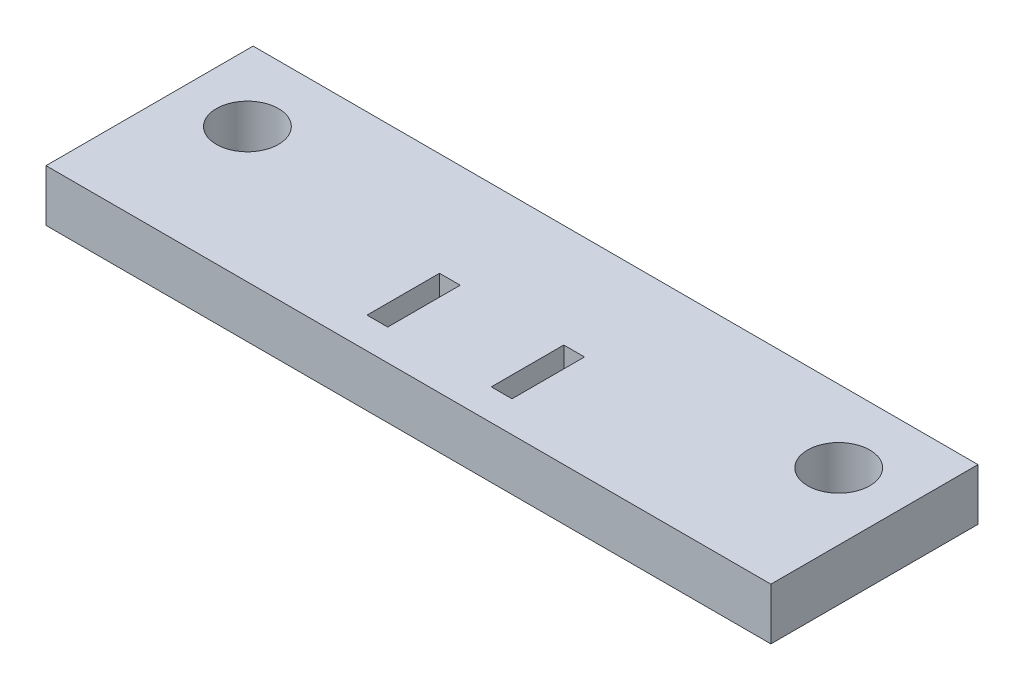
ISO-10303-21;
HEADER;
FILE_DESCRIPTION(('STEP AP214'),'2;1');
FILE_NAME('part.step','',(''),(''),'','','');
FILE_SCHEMA(('AUTOMOTIVE_DESIGN { 1 0 10303 214 1 1 1 1 }'));
ENDSEC;
DATA;
#1=APPLICATION_CONTEXT('core data for automotive mechanical design processes');
#2=APPLICATION_PROTOCOL_DEFINITION('international standard','automotive_design',2000,#1);
#3=PRODUCT_CONTEXT('',#1,'mechanical');
#4=PRODUCT('Part','Part','',(#3));
#5=PRODUCT_RELATED_PRODUCT_CATEGORY('part','',(#4));
#6=PRODUCT_DEFINITION_FORMATION('','',#4);
#7=PRODUCT_DEFINITION_CONTEXT('part definition',#1,'design');
#8=PRODUCT_DEFINITION('design','',#6,#7);
#9=PRODUCT_DEFINITION_SHAPE('','',#8);
#10=(LENGTH_UNIT() NAMED_UNIT(*) SI_UNIT(.MILLI.,.METRE.));
#11=(NAMED_UNIT(*) PLANE_ANGLE_UNIT() SI_UNIT($,.RADIAN.));
#12=(NAMED_UNIT(*) SI_UNIT($,.STERADIAN.) SOLID_ANGLE_UNIT());
#13=UNCERTAINTY_MEASURE_WITH_UNIT(LENGTH_MEASURE(1.E-05),#10,'distance_accuracy_value','');
#14=(GEOMETRIC_REPRESENTATION_CONTEXT(3) GLOBAL_UNCERTAINTY_ASSIGNED_CONTEXT((#13)) GLOBAL_UNIT_ASSIGNED_CONTEXT((#10,
#11,#12)) REPRESENTATION_CONTEXT('',''));
#15=CARTESIAN_POINT('',(0.,0.,0.));
#16=DIRECTION('',(0.,0.,1.));
#17=DIRECTION('',(1.,0.,0.));
#18=AXIS2_PLACEMENT_3D('',#15,#16,#17);
#19=CARTESIAN_POINT('',(0.,5.,0.));
#20=DIRECTION('',(0.,1.,0.));
#21=DIRECTION('',(0.,0.,1.));
#22=AXIS2_PLACEMENT_3D('',#19,#20,#21);
#23=PLANE('',#22);
#24=CARTESIAN_POINT('',(-28.55,5.,-3.));
#25=DIRECTION('',(0.,1.,0.));
#26=DIRECTION('',(0.,0.,1.));
#27=AXIS2_PLACEMENT_3D('',#24,#25,#26);
#28=CIRCLE('',#27,3.);
#29=CARTESIAN_POINT('',(-28.55,5.,0.));
#30=VERTEX_POINT('',#29);
#31=EDGE_CURVE('E199',#30,#30,#28,.T.);
#32=ORIENTED_EDGE('',*,*,#31,.F.);
#33=EDGE_LOOP('',(#32));
#34=FACE_BOUND('',#33,.T.);
#35=DIRECTION('',(0.,0.,-1.));
#36=VECTOR('',#35,1.);
#37=CARTESIAN_POINT('',(35.,5.,-10.));
#38=LINE('',#37,#36);
#39=CARTESIAN_POINT('',(35.,5.,10.));
#40=VERTEX_POINT('',#39);
#41=CARTESIAN_POINT('',(35.,5.,-10.));
#42=VERTEX_POINT('',#41);
#43=EDGE_CURVE('E205',#40,#42,#38,.T.);
#44=ORIENTED_EDGE('',*,*,#43,.T.);
#45=DIRECTION('',(-1.,0.,0.));
#46=VECTOR('',#45,1.);
#47=CARTESIAN_POINT('',(-35.,5.,-10.));
#48=LINE('',#47,#46);
#49=CARTESIAN_POINT('',(-35.,5.,-10.));
#50=VERTEX_POINT('',#49);
#51=EDGE_CURVE('E208',#42,#50,#48,.T.);
#52=ORIENTED_EDGE('',*,*,#51,.T.);
#53=DIRECTION('',(0.,0.,1.));
#54=VECTOR('',#53,1.);
#55=CARTESIAN_POINT('',(-35.,5.,-10.));
#56=LINE('',#55,#54);
#57=CARTESIAN_POINT('',(-35.,5.,10.));
#58=VERTEX_POINT('',#57);
#59=EDGE_CURVE('E211',#50,#58,#56,.T.);
#60=ORIENTED_EDGE('',*,*,#59,.T.);
#61=DIRECTION('',(1.,0.,0.));
#62=VECTOR('',#61,1.);
#63=CARTESIAN_POINT('',(-35.,5.,10.));
#64=LINE('',#63,#62);
#65=EDGE_CURVE('E213',#58,#40,#64,.T.);
#66=ORIENTED_EDGE('',*,*,#65,.T.);
#67=EDGE_LOOP('',(#44,#52,#60,#66));
#68=FACE_BOUND('',#67,.T.);
#69=CARTESIAN_POINT('',(28.55,5.,-3.));
#70=DIRECTION('',(0.,1.,0.));
#71=DIRECTION('',(0.,0.,1.));
#72=AXIS2_PLACEMENT_3D('',#69,#70,#71);
#73=CIRCLE('',#72,3.);
#74=CARTESIAN_POINT('',(28.55,5.,0.));
#75=VERTEX_POINT('',#74);
#76=EDGE_CURVE('E193',#75,#75,#73,.T.);
#77=ORIENTED_EDGE('',*,*,#76,.F.);
#78=EDGE_LOOP('',(#77));
#79=FACE_BOUND('',#78,.T.);
#80=DIRECTION('',(1.,0.,0.));
#81=VECTOR('',#80,1.);
#82=CARTESIAN_POINT('',(-7.,5.,7.));
#83=LINE('',#82,#81);
#84=CARTESIAN_POINT('',(-7.,5.,7.));
#85=VERTEX_POINT('',#84);
#86=CARTESIAN_POINT('',(-5.,5.,7.));
#87=VERTEX_POINT('',#86);
#88=EDGE_CURVE('E164',#85,#87,#83,.T.);
#89=ORIENTED_EDGE('',*,*,#88,.F.);
#90=DIRECTION('',(0.,0.,1.));
#91=VECTOR('',#90,1.);
#92=CARTESIAN_POINT('',(-7.,5.,7.));
#93=LINE('',#92,#91);
#94=CARTESIAN_POINT('',(-7.,5.,0.));
#95=VERTEX_POINT('',#94);
#96=EDGE_CURVE('E162',#95,#85,#93,.T.);
#97=ORIENTED_EDGE('',*,*,#96,.F.);
#98=DIRECTION('',(-1.,0.,0.));
#99=VECTOR('',#98,1.);
#100=CARTESIAN_POINT('',(-7.,5.,0.));
#101=LINE('',#100,#99);
#102=CARTESIAN_POINT('',(-5.,5.,0.));
#103=VERTEX_POINT('',#102);
#104=EDGE_CURVE('E170',#103,#95,#101,.T.);
#105=ORIENTED_EDGE('',*,*,#104,.F.);
#106=DIRECTION('',(0.,0.,-1.));
#107=VECTOR('',#106,1.);
#108=CARTESIAN_POINT('',(-5.,5.,7.));
#109=LINE('',#108,#107);
#110=EDGE_CURVE('E167',#87,#103,#109,.T.);
#111=ORIENTED_EDGE('',*,*,#110,.F.);
#112=EDGE_LOOP('',(#89,#97,#105,#111));
#113=FACE_BOUND('',#112,.T.);
#114=DIRECTION('',(1.,0.,0.));
#115=VECTOR('',#114,1.);
#116=CARTESIAN_POINT('',(5.,5.,7.));
#117=LINE('',#116,#115);
#118=CARTESIAN_POINT('',(5.,5.,7.));
#119=VERTEX_POINT('',#118);
#120=CARTESIAN_POINT('',(7.,5.,7.));
#121=VERTEX_POINT('',#120);
#122=EDGE_CURVE('E134',#119,#121,#117,.T.);
#123=ORIENTED_EDGE('',*,*,#122,.F.);
#124=DIRECTION('',(0.,0.,1.));
#125=VECTOR('',#124,1.);
#126=CARTESIAN_POINT('',(5.,5.,7.));
#127=LINE('',#126,#125);
#128=CARTESIAN_POINT('',(5.,5.,0.));
#129=VERTEX_POINT('',#128);
#130=EDGE_CURVE('E126',#129,#119,#127,.T.);
#131=ORIENTED_EDGE('',*,*,#130,.F.);
#132=DIRECTION('',(-1.,0.,0.));
#133=VECTOR('',#132,1.);
#134=CARTESIAN_POINT('',(5.,5.,0.));
#135=LINE('',#134,#133);
#136=CARTESIAN_POINT('',(7.,5.,0.));
#137=VERTEX_POINT('',#136);
#138=EDGE_CURVE('E148',#137,#129,#135,.T.);
#139=ORIENTED_EDGE('',*,*,#138,.F.);
#140=DIRECTION('',(0.,0.,-1.));
#141=VECTOR('',#140,1.);
#142=CARTESIAN_POINT('',(7.,5.,7.));
#143=LINE('',#142,#141);
#144=EDGE_CURVE('E146',#121,#137,#143,.T.);
#145=ORIENTED_EDGE('',*,*,#144,.F.);
#146=EDGE_LOOP('',(#123,#131,#139,#145));
#147=FACE_BOUND('',#146,.T.);
#148=ADVANCED_FACE('F37',(#34,#68,#79,#113,#147),#23,.T.);
#149=CARTESIAN_POINT('',(0.,0.,0.));
#150=DIRECTION('',(0.,1.,0.));
#151=DIRECTION('',(0.,0.,1.));
#152=AXIS2_PLACEMENT_3D('',#149,#150,#151);
#153=PLANE('',#152);
#154=DIRECTION('',(0.,0.,1.));
#155=VECTOR('',#154,1.);
#156=CARTESIAN_POINT('',(-7.,0.,7.));
#157=LINE('',#156,#155);
#158=CARTESIAN_POINT('',(-7.,0.,0.));
#159=VERTEX_POINT('',#158);
#160=CARTESIAN_POINT('',(-7.,0.,7.));
#161=VERTEX_POINT('',#160);
#162=EDGE_CURVE('E142',#159,#161,#157,.T.);
#163=ORIENTED_EDGE('',*,*,#162,.T.);
#164=DIRECTION('',(1.,0.,0.));
#165=VECTOR('',#164,1.);
#166=CARTESIAN_POINT('',(-7.,0.,7.));
#167=LINE('',#166,#165);
#168=CARTESIAN_POINT('',(-5.,0.,7.));
#169=VERTEX_POINT('',#168);
#170=EDGE_CURVE('E175',#161,#169,#167,.T.);
#171=ORIENTED_EDGE('',*,*,#170,.T.);
#172=DIRECTION('',(0.,0.,-1.));
#173=VECTOR('',#172,1.);
#174=CARTESIAN_POINT('',(-5.,0.,7.));
#175=LINE('',#174,#173);
#176=CARTESIAN_POINT('',(-5.,0.,0.));
#177=VERTEX_POINT('',#176);
#178=EDGE_CURVE('E178',#169,#177,#175,.T.);
#179=ORIENTED_EDGE('',*,*,#178,.T.);
#180=DIRECTION('',(-1.,0.,0.));
#181=VECTOR('',#180,1.);
#182=CARTESIAN_POINT('',(-7.,0.,0.));
#183=LINE('',#182,#181);
#184=EDGE_CURVE('E165',#177,#159,#183,.T.);
#185=ORIENTED_EDGE('',*,*,#184,.T.);
#186=EDGE_LOOP('',(#163,#171,#179,#185));
#187=FACE_BOUND('',#186,.T.);
#188=DIRECTION('',(0.,0.,-1.));
#189=VECTOR('',#188,1.);
#190=CARTESIAN_POINT('',(35.,0.,-10.));
#191=LINE('',#190,#189);
#192=CARTESIAN_POINT('',(35.,0.,10.));
#193=VERTEX_POINT('',#192);
#194=CARTESIAN_POINT('',(35.,0.,-10.));
#195=VERTEX_POINT('',#194);
#196=EDGE_CURVE('E202',#193,#195,#191,.T.);
#197=ORIENTED_EDGE('',*,*,#196,.F.);
#198=DIRECTION('',(1.,0.,0.));
#199=VECTOR('',#198,1.);
#200=CARTESIAN_POINT('',(-35.,0.,10.));
#201=LINE('',#200,#199);
#202=CARTESIAN_POINT('',(-35.,0.,10.));
#203=VERTEX_POINT('',#202);
#204=EDGE_CURVE('E209',#203,#193,#201,.T.);
#205=ORIENTED_EDGE('',*,*,#204,.F.);
#206=DIRECTION('',(0.,0.,1.));
#207=VECTOR('',#206,1.);
#208=CARTESIAN_POINT('',(-35.,0.,-10.));
#209=LINE('',#208,#207);
#210=CARTESIAN_POINT('',(-35.,0.,-10.));
#211=VERTEX_POINT('',#210);
#212=EDGE_CURVE('E220',#211,#203,#209,.T.);
#213=ORIENTED_EDGE('',*,*,#212,.F.);
#214=DIRECTION('',(-1.,0.,0.));
#215=VECTOR('',#214,1.);
#216=CARTESIAN_POINT('',(-35.,0.,-10.));
#217=LINE('',#216,#215);
#218=EDGE_CURVE('E218',#195,#211,#217,.T.);
#219=ORIENTED_EDGE('',*,*,#218,.F.);
#220=EDGE_LOOP('',(#197,#205,#213,#219));
#221=FACE_BOUND('',#220,.T.);
#222=CARTESIAN_POINT('',(-28.55,0.,-3.));
#223=DIRECTION('',(0.,1.,0.));
#224=DIRECTION('',(0.,0.,1.));
#225=AXIS2_PLACEMENT_3D('',#222,#223,#224);
#226=CIRCLE('',#225,3.);
#227=CARTESIAN_POINT('',(-28.55,0.,0.));
#228=VERTEX_POINT('',#227);
#229=EDGE_CURVE('E196',#228,#228,#226,.T.);
#230=ORIENTED_EDGE('',*,*,#229,.T.);
#231=EDGE_LOOP('',(#230));
#232=FACE_BOUND('',#231,.T.);
#233=CARTESIAN_POINT('',(28.55,0.,-3.));
#234=DIRECTION('',(0.,1.,0.));
#235=DIRECTION('',(0.,0.,1.));
#236=AXIS2_PLACEMENT_3D('',#233,#234,#235);
#237=CIRCLE('',#236,3.);
#238=CARTESIAN_POINT('',(28.55,0.,0.));
#239=VERTEX_POINT('',#238);
#240=EDGE_CURVE('E192',#239,#239,#237,.T.);
#241=ORIENTED_EDGE('',*,*,#240,.T.);
#242=EDGE_LOOP('',(#241));
#243=FACE_BOUND('',#242,.T.);
#244=DIRECTION('',(0.,0.,1.));
#245=VECTOR('',#244,1.);
#246=CARTESIAN_POINT('',(5.,0.,7.));
#247=LINE('',#246,#245);
#248=CARTESIAN_POINT('',(5.,0.,0.));
#249=VERTEX_POINT('',#248);
#250=CARTESIAN_POINT('',(5.,0.,7.));
#251=VERTEX_POINT('',#250);
#252=EDGE_CURVE('E60',#249,#251,#247,.T.);
#253=ORIENTED_EDGE('',*,*,#252,.T.);
#254=DIRECTION('',(1.,0.,0.));
#255=VECTOR('',#254,1.);
#256=CARTESIAN_POINT('',(5.,0.,7.));
#257=LINE('',#256,#255);
#258=CARTESIAN_POINT('',(7.,0.,7.));
#259=VERTEX_POINT('',#258);
#260=EDGE_CURVE('E141',#251,#259,#257,.T.);
#261=ORIENTED_EDGE('',*,*,#260,.T.);
#262=DIRECTION('',(0.,0.,-1.));
#263=VECTOR('',#262,1.);
#264=CARTESIAN_POINT('',(7.,0.,7.));
#265=LINE('',#264,#263);
#266=CARTESIAN_POINT('',(7.,0.,0.));
#267=VERTEX_POINT('',#266);
#268=EDGE_CURVE('E154',#259,#267,#265,.T.);
#269=ORIENTED_EDGE('',*,*,#268,.T.);
#270=DIRECTION('',(-1.,0.,0.));
#271=VECTOR('',#270,1.);
#272=CARTESIAN_POINT('',(5.,0.,0.));
#273=LINE('',#272,#271);
#274=EDGE_CURVE('E135',#267,#249,#273,.T.);
#275=ORIENTED_EDGE('',*,*,#274,.T.);
#276=EDGE_LOOP('',(#253,#261,#269,#275));
#277=FACE_BOUND('',#276,.T.);
#278=ADVANCED_FACE('F238',(#187,#221,#232,#243,#277),#153,.F.);
#279=CARTESIAN_POINT('',(35.,5.,-10.));
#280=DIRECTION('',(-1.,0.,0.));
#281=DIRECTION('',(0.,0.,1.));
#282=AXIS2_PLACEMENT_3D('',#279,#280,#281);
#283=PLANE('',#282);
#284=ORIENTED_EDGE('',*,*,#196,.T.);
#285=DIRECTION('',(0.,-1.,0.));
#286=VECTOR('',#285,1.);
#287=CARTESIAN_POINT('',(35.,5.,-10.));
#288=LINE('',#287,#286);
#289=EDGE_CURVE('E11',#42,#195,#288,.T.);
#290=ORIENTED_EDGE('',*,*,#289,.F.);
#291=ORIENTED_EDGE('',*,*,#43,.F.);
#292=DIRECTION('',(0.,-1.,0.));
#293=VECTOR('',#292,1.);
#294=CARTESIAN_POINT('',(35.,5.,10.));
#295=LINE('',#294,#293);
#296=EDGE_CURVE('E215',#40,#193,#295,.T.);
#297=ORIENTED_EDGE('',*,*,#296,.T.);
#298=EDGE_LOOP('',(#284,#290,#291,#297));
#299=FACE_BOUND('',#298,.T.);
#300=ADVANCED_FACE('F39',(#299),#283,.F.);
#301=CARTESIAN_POINT('',(-35.,5.,-10.));
#302=DIRECTION('',(0.,0.,1.));
#303=DIRECTION('',(1.,0.,0.));
#304=AXIS2_PLACEMENT_3D('',#301,#302,#303);
#305=PLANE('',#304);
#306=ORIENTED_EDGE('',*,*,#218,.T.);
#307=DIRECTION('',(0.,-1.,0.));
#308=VECTOR('',#307,1.);
#309=CARTESIAN_POINT('',(-35.,5.,-10.));
#310=LINE('',#309,#308);
#311=EDGE_CURVE('E45',#50,#211,#310,.T.);
#312=ORIENTED_EDGE('',*,*,#311,.F.);
#313=ORIENTED_EDGE('',*,*,#51,.F.);
#314=ORIENTED_EDGE('',*,*,#289,.T.);
#315=EDGE_LOOP('',(#306,#312,#313,#314));
#316=FACE_BOUND('',#315,.T.);
#317=ADVANCED_FACE('F249',(#316),#305,.F.);
#318=CARTESIAN_POINT('',(-35.,5.,-10.));
#319=DIRECTION('',(1.,0.,0.));
#320=DIRECTION('',(0.,0.,-1.));
#321=AXIS2_PLACEMENT_3D('',#318,#319,#320);
#322=PLANE('',#321);
#323=ORIENTED_EDGE('',*,*,#212,.T.);
#324=DIRECTION('',(0.,-1.,0.));
#325=VECTOR('',#324,1.);
#326=CARTESIAN_POINT('',(-35.,5.,10.));
#327=LINE('',#326,#325);
#328=EDGE_CURVE('E225',#58,#203,#327,.T.);
#329=ORIENTED_EDGE('',*,*,#328,.F.);
#330=ORIENTED_EDGE('',*,*,#59,.F.);
#331=ORIENTED_EDGE('',*,*,#311,.T.);
#332=EDGE_LOOP('',(#323,#329,#330,#331));
#333=FACE_BOUND('',#332,.T.);
#334=ADVANCED_FACE('F232',(#333),#322,.F.);
#335=CARTESIAN_POINT('',(-35.,5.,10.));
#336=DIRECTION('',(0.,0.,-1.));
#337=DIRECTION('',(-1.,0.,0.));
#338=AXIS2_PLACEMENT_3D('',#335,#336,#337);
#339=PLANE('',#338);
#340=ORIENTED_EDGE('',*,*,#204,.T.);
#341=ORIENTED_EDGE('',*,*,#296,.F.);
#342=ORIENTED_EDGE('',*,*,#65,.F.);
#343=ORIENTED_EDGE('',*,*,#328,.T.);
#344=EDGE_LOOP('',(#340,#341,#342,#343));
#345=FACE_BOUND('',#344,.T.);
#346=ADVANCED_FACE('F242',(#345),#339,.F.);
#347=CARTESIAN_POINT('',(-28.55,5.,-3.));
#348=DIRECTION('',(0.,-1.,0.));
#349=DIRECTION('',(0.,0.,-1.));
#350=AXIS2_PLACEMENT_3D('',#347,#348,#349);
#351=CYLINDRICAL_SURFACE('',#350,3.);
#352=ORIENTED_EDGE('',*,*,#31,.T.);
#353=EDGE_LOOP('',(#352));
#354=FACE_BOUND('',#353,.T.);
#355=ORIENTED_EDGE('',*,*,#229,.F.);
#356=EDGE_LOOP('',(#355));
#357=FACE_BOUND('',#356,.T.);
#358=ADVANCED_FACE('F266',(#354,#357),#351,.F.);
#359=CARTESIAN_POINT('',(28.55,5.,-3.));
#360=DIRECTION('',(0.,-1.,0.));
#361=DIRECTION('',(0.,0.,-1.));
#362=AXIS2_PLACEMENT_3D('',#359,#360,#361);
#363=CYLINDRICAL_SURFACE('',#362,3.);
#364=ORIENTED_EDGE('',*,*,#76,.T.);
#365=EDGE_LOOP('',(#364));
#366=FACE_BOUND('',#365,.T.);
#367=ORIENTED_EDGE('',*,*,#240,.F.);
#368=EDGE_LOOP('',(#367));
#369=FACE_BOUND('',#368,.T.);
#370=ADVANCED_FACE('F273',(#366,#369),#363,.F.);
#371=CARTESIAN_POINT('',(-7.,5.,7.));
#372=DIRECTION('',(1.,0.,0.));
#373=DIRECTION('',(0.,0.,-1.));
#374=AXIS2_PLACEMENT_3D('',#371,#372,#373);
#375=PLANE('',#374);
#376=ORIENTED_EDGE('',*,*,#162,.F.);
#377=DIRECTION('',(0.,-1.,0.));
#378=VECTOR('',#377,1.);
#379=CARTESIAN_POINT('',(-7.,5.,0.));
#380=LINE('',#379,#378);
#381=EDGE_CURVE('E172',#95,#159,#380,.T.);
#382=ORIENTED_EDGE('',*,*,#381,.F.);
#383=ORIENTED_EDGE('',*,*,#96,.T.);
#384=DIRECTION('',(0.,-1.,0.));
#385=VECTOR('',#384,1.);
#386=CARTESIAN_POINT('',(-7.,5.,7.));
#387=LINE('',#386,#385);
#388=EDGE_CURVE('E189',#85,#161,#387,.T.);
#389=ORIENTED_EDGE('',*,*,#388,.T.);
#390=EDGE_LOOP('',(#376,#382,#383,#389));
#391=FACE_BOUND('',#390,.T.);
#392=ADVANCED_FACE('F278',(#391),#375,.T.);
#393=CARTESIAN_POINT('',(-7.,5.,7.));
#394=DIRECTION('',(0.,0.,-1.));
#395=DIRECTION('',(-1.,0.,0.));
#396=AXIS2_PLACEMENT_3D('',#393,#394,#395);
#397=PLANE('',#396);
#398=ORIENTED_EDGE('',*,*,#170,.F.);
#399=ORIENTED_EDGE('',*,*,#388,.F.);
#400=ORIENTED_EDGE('',*,*,#88,.T.);
#401=DIRECTION('',(0.,-1.,0.));
#402=VECTOR('',#401,1.);
#403=CARTESIAN_POINT('',(-5.,5.,7.));
#404=LINE('',#403,#402);
#405=EDGE_CURVE('E187',#87,#169,#404,.T.);
#406=ORIENTED_EDGE('',*,*,#405,.T.);
#407=EDGE_LOOP('',(#398,#399,#400,#406));
#408=FACE_BOUND('',#407,.T.);
#409=ADVANCED_FACE('F307',(#408),#397,.T.);
#410=CARTESIAN_POINT('',(-5.,5.,7.));
#411=DIRECTION('',(-1.,0.,0.));
#412=DIRECTION('',(0.,0.,1.));
#413=AXIS2_PLACEMENT_3D('',#410,#411,#412);
#414=PLANE('',#413);
#415=ORIENTED_EDGE('',*,*,#178,.F.);
#416=ORIENTED_EDGE('',*,*,#405,.F.);
#417=ORIENTED_EDGE('',*,*,#110,.T.);
#418=DIRECTION('',(0.,-1.,0.));
#419=VECTOR('',#418,1.);
#420=CARTESIAN_POINT('',(-5.,5.,0.));
#421=LINE('',#420,#419);
#422=EDGE_CURVE('E185',#103,#177,#421,.T.);
#423=ORIENTED_EDGE('',*,*,#422,.T.);
#424=EDGE_LOOP('',(#415,#416,#417,#423));
#425=FACE_BOUND('',#424,.T.);
#426=ADVANCED_FACE('F303',(#425),#414,.T.);
#427=CARTESIAN_POINT('',(-7.,5.,0.));
#428=DIRECTION('',(0.,0.,1.));
#429=DIRECTION('',(1.,0.,0.));
#430=AXIS2_PLACEMENT_3D('',#427,#428,#429);
#431=PLANE('',#430);
#432=ORIENTED_EDGE('',*,*,#184,.F.);
#433=ORIENTED_EDGE('',*,*,#422,.F.);
#434=ORIENTED_EDGE('',*,*,#104,.T.);
#435=ORIENTED_EDGE('',*,*,#381,.T.);
#436=EDGE_LOOP('',(#432,#433,#434,#435));
#437=FACE_BOUND('',#436,.T.);
#438=ADVANCED_FACE('F300',(#437),#431,.T.);
#439=CARTESIAN_POINT('',(5.,5.,7.));
#440=DIRECTION('',(1.,0.,0.));
#441=DIRECTION('',(0.,0.,-1.));
#442=AXIS2_PLACEMENT_3D('',#439,#440,#441);
#443=PLANE('',#442);
#444=ORIENTED_EDGE('',*,*,#252,.F.);
#445=DIRECTION('',(0.,-1.,0.));
#446=VECTOR('',#445,1.);
#447=CARTESIAN_POINT('',(5.,5.,0.));
#448=LINE('',#447,#446);
#449=EDGE_CURVE('E130',#129,#249,#448,.T.);
#450=ORIENTED_EDGE('',*,*,#449,.F.);
#451=ORIENTED_EDGE('',*,*,#130,.T.);
#452=DIRECTION('',(0.,-1.,0.));
#453=VECTOR('',#452,1.);
#454=CARTESIAN_POINT('',(5.,5.,7.));
#455=LINE('',#454,#453);
#456=EDGE_CURVE('E129',#119,#251,#455,.T.);
#457=ORIENTED_EDGE('',*,*,#456,.T.);
#458=EDGE_LOOP('',(#444,#450,#451,#457));
#459=FACE_BOUND('',#458,.T.);
#460=ADVANCED_FACE('F128',(#459),#443,.T.);
#461=CARTESIAN_POINT('',(5.,5.,7.));
#462=DIRECTION('',(0.,0.,-1.));
#463=DIRECTION('',(-1.,0.,0.));
#464=AXIS2_PLACEMENT_3D('',#461,#462,#463);
#465=PLANE('',#464);
#466=ORIENTED_EDGE('',*,*,#260,.F.);
#467=ORIENTED_EDGE('',*,*,#456,.F.);
#468=ORIENTED_EDGE('',*,*,#122,.T.);
#469=DIRECTION('',(0.,-1.,0.));
#470=VECTOR('',#469,1.);
#471=CARTESIAN_POINT('',(7.,5.,7.));
#472=LINE('',#471,#470);
#473=EDGE_CURVE('E143',#121,#259,#472,.T.);
#474=ORIENTED_EDGE('',*,*,#473,.T.);
#475=EDGE_LOOP('',(#466,#467,#468,#474));
#476=FACE_BOUND('',#475,.T.);
#477=ADVANCED_FACE('F138',(#476),#465,.T.);
#478=CARTESIAN_POINT('',(7.,5.,7.));
#479=DIRECTION('',(-1.,0.,0.));
#480=DIRECTION('',(0.,0.,1.));
#481=AXIS2_PLACEMENT_3D('',#478,#479,#480);
#482=PLANE('',#481);
#483=ORIENTED_EDGE('',*,*,#268,.F.);
#484=ORIENTED_EDGE('',*,*,#473,.F.);
#485=ORIENTED_EDGE('',*,*,#144,.T.);
#486=DIRECTION('',(0.,-1.,0.));
#487=VECTOR('',#486,1.);
#488=CARTESIAN_POINT('',(7.,5.,0.));
#489=LINE('',#488,#487);
#490=EDGE_CURVE('E52',#137,#267,#489,.T.);
#491=ORIENTED_EDGE('',*,*,#490,.T.);
#492=EDGE_LOOP('',(#483,#484,#485,#491));
#493=FACE_BOUND('',#492,.T.);
#494=ADVANCED_FACE('F288',(#493),#482,.T.);
#495=CARTESIAN_POINT('',(5.,5.,0.));
#496=DIRECTION('',(0.,0.,1.));
#497=DIRECTION('',(1.,0.,0.));
#498=AXIS2_PLACEMENT_3D('',#495,#496,#497);
#499=PLANE('',#498);
#500=ORIENTED_EDGE('',*,*,#274,.F.);
#501=ORIENTED_EDGE('',*,*,#490,.F.);
#502=ORIENTED_EDGE('',*,*,#138,.T.);
#503=ORIENTED_EDGE('',*,*,#449,.T.);
#504=EDGE_LOOP('',(#500,#501,#502,#503));
#505=FACE_BOUND('',#504,.T.);
#506=ADVANCED_FACE('F286',(#505),#499,.T.);
#507=CLOSED_SHELL('',(#148,#278,#300,#317,#334,#346,#358,#370,#392,#409,#426,#438,#460,#477,
#494,#506));
#508=MANIFOLD_SOLID_BREP('B2',#507);
#509=ADVANCED_BREP_SHAPE_REPRESENTATION('',(#18,#508),#14);
#510=SHAPE_DEFINITION_REPRESENTATION(#9,#509);
ENDSEC;
END-ISO-10303-21;
